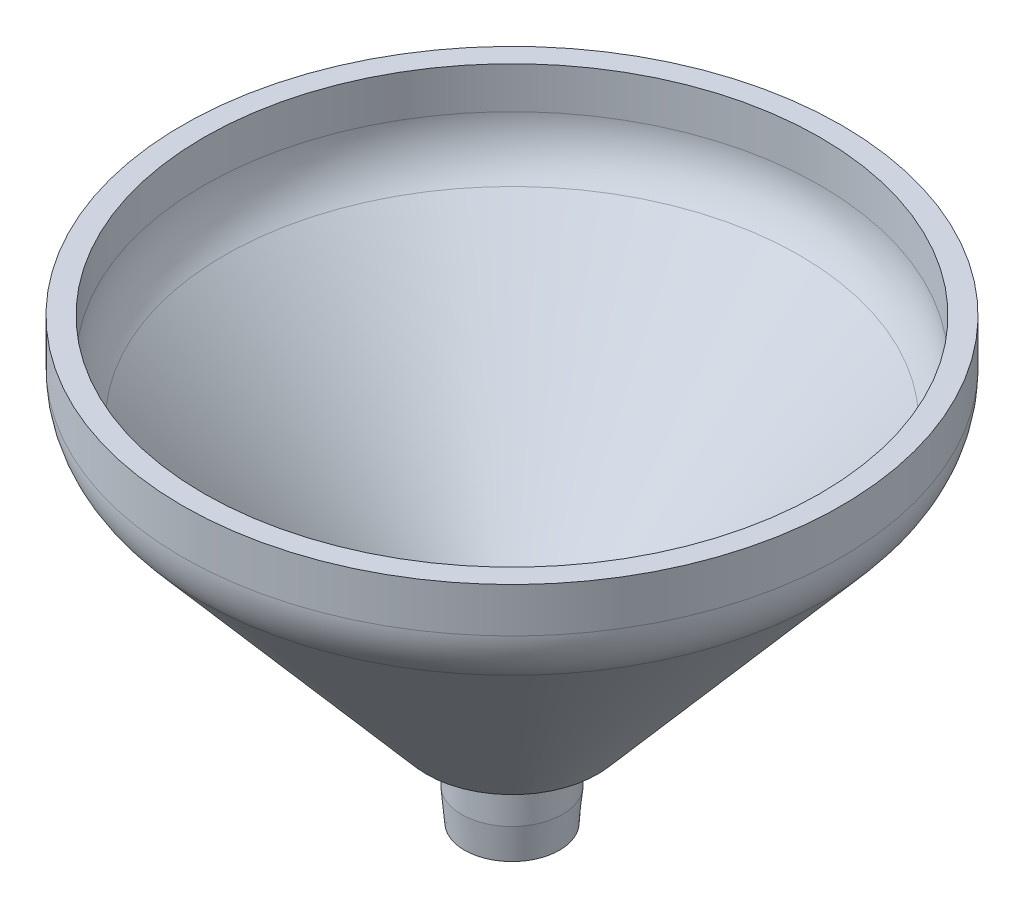
ISO-10303-21;
HEADER;
FILE_DESCRIPTION(('STEP AP214'),'2;1');
FILE_NAME('part.step','',(''),(''),'','','');
FILE_SCHEMA(('AUTOMOTIVE_DESIGN { 1 0 10303 214 1 1 1 1 }'));
ENDSEC;
DATA;
#1=APPLICATION_CONTEXT('core data for automotive mechanical design processes');
#2=APPLICATION_PROTOCOL_DEFINITION('international standard','automotive_design',2000,#1);
#3=PRODUCT_CONTEXT('',#1,'mechanical');
#4=PRODUCT('Part','Part','',(#3));
#5=PRODUCT_RELATED_PRODUCT_CATEGORY('part','',(#4));
#6=PRODUCT_DEFINITION_FORMATION('','',#4);
#7=PRODUCT_DEFINITION_CONTEXT('part definition',#1,'design');
#8=PRODUCT_DEFINITION('design','',#6,#7);
#9=PRODUCT_DEFINITION_SHAPE('','',#8);
#10=(LENGTH_UNIT() NAMED_UNIT(*) SI_UNIT(.MILLI.,.METRE.));
#11=(NAMED_UNIT(*) PLANE_ANGLE_UNIT() SI_UNIT($,.RADIAN.));
#12=(NAMED_UNIT(*) SI_UNIT($,.STERADIAN.) SOLID_ANGLE_UNIT());
#13=UNCERTAINTY_MEASURE_WITH_UNIT(LENGTH_MEASURE(1.E-05),#10,'distance_accuracy_value','');
#14=(GEOMETRIC_REPRESENTATION_CONTEXT(3) GLOBAL_UNCERTAINTY_ASSIGNED_CONTEXT((#13)) GLOBAL_UNIT_ASSIGNED_CONTEXT((#10,
#11,#12)) REPRESENTATION_CONTEXT('',''));
#15=CARTESIAN_POINT('',(0.,0.,0.));
#16=DIRECTION('',(0.,0.,1.));
#17=DIRECTION('',(1.,0.,0.));
#18=AXIS2_PLACEMENT_3D('',#15,#16,#17);
#19=CARTESIAN_POINT('',(0.,0.,0.));
#20=DIRECTION('',(0.,-1.,0.));
#21=DIRECTION('',(0.,0.,-1.));
#22=AXIS2_PLACEMENT_3D('',#19,#20,#21);
#23=CYLINDRICAL_SURFACE('',#22,5.5);
#24=CARTESIAN_POINT('',(0.,9.85786437626905,0.));
#25=DIRECTION('',(0.,1.,0.));
#26=DIRECTION('',(0.,0.,1.));
#27=AXIS2_PLACEMENT_3D('',#24,#25,#26);
#28=CIRCLE('',#27,5.5);
#29=CARTESIAN_POINT('',(0.,9.85786437626905,5.5));
#30=VERTEX_POINT('',#29);
#31=EDGE_CURVE('E57',#30,#30,#28,.T.);
#32=ORIENTED_EDGE('',*,*,#31,.T.);
#33=EDGE_LOOP('',(#32));
#34=FACE_BOUND('',#33,.T.);
#35=CARTESIAN_POINT('',(0.,0.,0.));
#36=DIRECTION('',(0.,-1.,0.));
#37=DIRECTION('',(0.,0.,-1.));
#38=AXIS2_PLACEMENT_3D('',#35,#36,#37);
#39=CIRCLE('',#38,5.5);
#40=CARTESIAN_POINT('',(0.,0.,-5.5));
#41=VERTEX_POINT('',#40);
#42=EDGE_CURVE('E66',#41,#41,#39,.T.);
#43=ORIENTED_EDGE('',*,*,#42,.T.);
#44=EDGE_LOOP('',(#43));
#45=FACE_BOUND('',#44,.T.);
#46=ADVANCED_FACE('F33',(#34,#45),#23,.F.);
#47=CARTESIAN_POINT('',(5.5,0.,0.));
#48=DIRECTION('',(0.,-1.,0.));
#49=DIRECTION('',(0.,0.,-1.));
#50=AXIS2_PLACEMENT_3D('',#47,#48,#49);
#51=PLANE('',#50);
#52=CARTESIAN_POINT('',(0.,0.,0.));
#53=DIRECTION('',(0.,-1.,0.));
#54=DIRECTION('',(0.,0.,-1.));
#55=AXIS2_PLACEMENT_3D('',#52,#53,#54);
#56=CIRCLE('',#55,6.69999999999997);
#57=CARTESIAN_POINT('',(0.,0.,6.69999999999997));
#58=VERTEX_POINT('',#57);
#59=EDGE_CURVE('E41',#58,#58,#56,.T.);
#60=ORIENTED_EDGE('',*,*,#59,.T.);
#61=EDGE_LOOP('',(#60));
#62=FACE_BOUND('',#61,.T.);
#63=ORIENTED_EDGE('',*,*,#42,.F.);
#64=EDGE_LOOP('',(#63));
#65=FACE_BOUND('',#64,.T.);
#66=ADVANCED_FACE('F100',(#62,#65),#51,.T.);
#67=CARTESIAN_POINT('',(0.,0.,0.));
#68=DIRECTION('',(0.,-1.,0.));
#69=DIRECTION('',(0.,0.,-1.));
#70=AXIS2_PLACEMENT_3D('',#67,#68,#69);
#71=CYLINDRICAL_SURFACE('',#70,7.1);
#72=CARTESIAN_POINT('',(0.,4.57202092110491,0.));
#73=DIRECTION('',(0.,-1.,0.));
#74=DIRECTION('',(0.,0.,-1.));
#75=AXIS2_PLACEMENT_3D('',#72,#73,#74);
#76=CIRCLE('',#75,7.1);
#77=CARTESIAN_POINT('',(0.,4.57202092110491,7.1));
#78=VERTEX_POINT('',#77);
#79=EDGE_CURVE('E10',#78,#78,#76,.F.);
#80=ORIENTED_EDGE('',*,*,#79,.T.);
#81=EDGE_LOOP('',(#80));
#82=FACE_BOUND('',#81,.T.);
#83=CARTESIAN_POINT('',(0.,12.,0.));
#84=DIRECTION('',(0.,-1.,0.));
#85=DIRECTION('',(0.,0.,-1.));
#86=AXIS2_PLACEMENT_3D('',#83,#84,#85);
#87=CIRCLE('',#86,7.1);
#88=CARTESIAN_POINT('',(0.,12.,-7.1));
#89=VERTEX_POINT('',#88);
#90=EDGE_CURVE('E69',#89,#89,#87,.T.);
#91=ORIENTED_EDGE('',*,*,#90,.T.);
#92=EDGE_LOOP('',(#91));
#93=FACE_BOUND('',#92,.T.);
#94=ADVANCED_FACE('F106',(#82,#93),#71,.T.);
#95=CARTESIAN_POINT('',(7.1,12.,0.));
#96=DIRECTION('',(0.,-1.,0.));
#97=DIRECTION('',(0.,0.,-1.));
#98=AXIS2_PLACEMENT_3D('',#95,#96,#97);
#99=PLANE('',#98);
#100=CARTESIAN_POINT('',(0.,12.,0.));
#101=DIRECTION('',(0.,-1.,0.));
#102=DIRECTION('',(0.,0.,-1.));
#103=AXIS2_PLACEMENT_3D('',#100,#101,#102);
#104=CIRCLE('',#103,12.1);
#105=CARTESIAN_POINT('',(0.,12.,12.1));
#106=VERTEX_POINT('',#105);
#107=EDGE_CURVE('E72',#106,#106,#104,.T.);
#108=ORIENTED_EDGE('',*,*,#107,.T.);
#109=EDGE_LOOP('',(#108));
#110=FACE_BOUND('',#109,.T.);
#111=ORIENTED_EDGE('',*,*,#90,.F.);
#112=EDGE_LOOP('',(#111));
#113=FACE_BOUND('',#112,.T.);
#114=ADVANCED_FACE('F141',(#110,#113),#99,.T.);
#115=CARTESIAN_POINT('',(0.,12.,0.));
#116=DIRECTION('',(0.,1.,0.));
#117=DIRECTION('',(0.,0.,1.));
#118=AXIS2_PLACEMENT_3D('',#115,#116,#117);
#119=CONICAL_SURFACE('',#118,12.1,0.710271007486688);
#120=CARTESIAN_POINT('',(0.,49.1881999571126,0.));
#121=DIRECTION('',(0.,-1.,0.));
#122=DIRECTION('',(0.,0.,-1.));
#123=AXIS2_PLACEMENT_3D('',#120,#121,#122);
#124=CIRCLE('',#123,44.081851963117);
#125=CARTESIAN_POINT('',(0.,49.1881999571126,44.081851963117));
#126=VERTEX_POINT('',#125);
#127=EDGE_CURVE('E54',#126,#126,#124,.T.);
#128=CARTESIAN_POINT('',(0.,49.1881999571126,44.081851963117));
#129=CARTESIAN_POINT('',(0.,48.800822874226,43.7487076718345));
#130=CARTESIAN_POINT('',(0.,48.4134457913394,43.415563380552));
#131=CARTESIAN_POINT('',(0.,47.6386916255662,42.7492747979871));
#132=CARTESIAN_POINT('',(0.,47.2513145426796,42.4161305067046));
#133=CARTESIAN_POINT('',(0.,46.4765603769065,41.7498419241397));
#134=CARTESIAN_POINT('',(0.,46.0891832940199,41.4166976328572));
#135=CARTESIAN_POINT('',(0.,45.3144291282467,40.7504090502923));
#136=CARTESIAN_POINT('',(0.,44.9270520453601,40.4172647590098));
#137=CARTESIAN_POINT('',(0.,44.1522978795869,39.7509761764449));
#138=CARTESIAN_POINT('',(0.,43.7649207967004,39.4178318851624));
#139=CARTESIAN_POINT('',(0.,42.9901666309272,38.7515433025975));
#140=CARTESIAN_POINT('',(0.,42.6027895480406,38.418399011315));
#141=CARTESIAN_POINT('',(0.,41.8280353822674,37.7521104287501));
#142=CARTESIAN_POINT('',(0.,41.4406582993808,37.4189661374676));
#143=CARTESIAN_POINT('',(0.,40.6659041336076,36.7526775549027));
#144=CARTESIAN_POINT('',(0.,40.278527050721,36.4195332636202));
#145=CARTESIAN_POINT('',(0.,39.5037728849479,35.7532446810552));
#146=CARTESIAN_POINT('',(0.,39.1163958020613,35.4201003897728));
#147=CARTESIAN_POINT('',(0.,38.3416416362881,34.7538118072078));
#148=CARTESIAN_POINT('',(0.,37.9542645534015,34.4206675159254));
#149=CARTESIAN_POINT('',(0.,37.1795103876283,33.7543789333604));
#150=CARTESIAN_POINT('',(0.,36.7921333047417,33.421234642078));
#151=CARTESIAN_POINT('',(0.,36.0173791389686,32.754946059513));
#152=CARTESIAN_POINT('',(0.,35.630002056082,32.4218017682306));
#153=CARTESIAN_POINT('',(0.,34.8552478903088,31.7555131856656));
#154=CARTESIAN_POINT('',(0.,34.4678708074222,31.4223688943832));
#155=CARTESIAN_POINT('',(0.,33.693116641649,30.7560803118182));
#156=CARTESIAN_POINT('',(0.,33.3057395587624,30.4229360205358));
#157=CARTESIAN_POINT('',(0.,32.5309853929893,29.7566474379708));
#158=CARTESIAN_POINT('',(0.,32.1436083101027,29.4235031466884));
#159=CARTESIAN_POINT('',(0.,31.3688541443295,28.7572145641234));
#160=CARTESIAN_POINT('',(0.,30.9814770614429,28.4240702728409));
#161=CARTESIAN_POINT('',(0.,30.2067228956697,27.757781690276));
#162=CARTESIAN_POINT('',(0.,29.8193458127831,27.4246373989935));
#163=CARTESIAN_POINT('',(0.,29.0445916470099,26.7583488164286));
#164=CARTESIAN_POINT('',(0.,28.6572145641234,26.4252045251461));
#165=CARTESIAN_POINT('',(0.,27.8824603983502,25.7589159425812));
#166=CARTESIAN_POINT('',(0.,27.4950833154636,25.4257716512987));
#167=CARTESIAN_POINT('',(0.,26.7203291496904,24.7594830687338));
#168=CARTESIAN_POINT('',(0.,26.3329520668038,24.4263387774513));
#169=CARTESIAN_POINT('',(0.,25.5581979010306,23.7600501948864));
#170=CARTESIAN_POINT('',(0.,25.170820818144,23.4269059036039));
#171=CARTESIAN_POINT('',(0.,24.3960666523709,22.760617321039));
#172=CARTESIAN_POINT('',(0.,24.0086895694843,22.4274730297565));
#173=CARTESIAN_POINT('',(0.,23.2339354037111,21.7611844471916));
#174=CARTESIAN_POINT('',(0.,22.8465583208245,21.4280401559091));
#175=CARTESIAN_POINT('',(0.,22.0718041550513,20.7617515733442));
#176=CARTESIAN_POINT('',(0.,21.6844270721647,20.4286072820617));
#177=CARTESIAN_POINT('',(0.,20.9096729063916,19.7623186994968));
#178=CARTESIAN_POINT('',(0.,20.522295823505,19.4291744082143));
#179=CARTESIAN_POINT('',(0.,19.7475416577318,18.7628858256494));
#180=CARTESIAN_POINT('',(0.,19.3601645748452,18.4297415343669));
#181=CARTESIAN_POINT('',(0.,18.585410409072,17.763452951802));
#182=CARTESIAN_POINT('',(0.,18.1980333261854,17.4303086605195));
#183=CARTESIAN_POINT('',(0.,17.4232791604123,16.7640200779546));
#184=CARTESIAN_POINT('',(0.,17.0359020775257,16.4308757866721));
#185=CARTESIAN_POINT('',(0.,16.2611479117525,15.7645872041072));
#186=CARTESIAN_POINT('',(0.,15.8737708288659,15.4314429128247));
#187=CARTESIAN_POINT('',(0.,15.0990166630927,14.7651543302597));
#188=CARTESIAN_POINT('',(0.,14.7116395802061,14.4320100389773));
#189=CARTESIAN_POINT('',(0.,13.936885414433,13.7657214564123));
#190=CARTESIAN_POINT('',(0.,13.5495083315464,13.4325771651299));
#191=CARTESIAN_POINT('',(0.,12.7747541657732,12.7662885825649));
#192=CARTESIAN_POINT('',(0.,12.3873770828866,12.4331442912825));
#193=CARTESIAN_POINT('',(0.,12.,12.1));
#194=B_SPLINE_CURVE_WITH_KNOTS('',3,(#128,#129,#130,#131,#132,#133,#134,#135,#136,#137,#138,
#139,#140,#141,#142,#143,#144,#145,#146,#147,#148,#149,#150,#151,#152,#153,#154,#155,#156,#157,
#158,#159,#160,#161,#162,#163,#164,#165,#166,#167,#168,#169,#170,#171,#172,#173,#174,#175,#176,
#177,#178,#179,#180,#181,#182,#183,#184,#185,#186,#187,#188,#189,#190,#191,#192,#193),
.UNSPECIFIED.,.F.,.F.,(4,2,2,2,2,2,2,2,2,2,2,2,2,2,2,2,2,2,2,2,2,2,2,2,2,2,2,2,2,2,2,2,4),(0.,
1.53278018921123,3.06556037842245,4.59834056763366,6.13112075684489,7.66390094605611,
9.19668113526734,10.7294613244786,12.2622415136898,13.795021702901,15.3278018921122,
16.8605820813235,18.3933622705347,19.9261424597459,21.4589226489571,22.9917028381684,
24.5244830273796,26.0572632165908,27.590043405802,29.1228235950132,30.6556037842245,
32.1883839734357,33.7211641626469,35.2539443518582,36.7867245410694,38.3195047302806,
39.8522849194918,41.3850651087031,42.9178452979143,44.4506254871255,45.9834056763367,
47.516185865548,49.0489660547592),.UNSPECIFIED.);
#195=EDGE_CURVE('BSEAM184',#126,#106,#194,.T.);
#196=ORIENTED_EDGE('',*,*,#127,.T.);
#197=ORIENTED_EDGE('',*,*,#107,.F.);
#198=ORIENTED_EDGE('',*,*,#195,.T.);
#199=ORIENTED_EDGE('',*,*,#195,.F.);
#200=EDGE_LOOP('',(#196,#198,#197,#199));
#201=FACE_BOUND('',#200,.T.);
#202=ADVANCED_FACE('F184',(#201),#119,.T.);
#203=CARTESIAN_POINT('',(0.,0.,0.));
#204=DIRECTION('',(0.,-1.,0.));
#205=DIRECTION('',(0.,0.,-1.));
#206=AXIS2_PLACEMENT_3D('',#203,#204,#205);
#207=CYLINDRICAL_SURFACE('',#206,46.5000000000001);
#208=CARTESIAN_POINT('',(0.,55.7085926453931,0.));
#209=DIRECTION('',(0.,1.,0.));
#210=DIRECTION('',(0.,0.,1.));
#211=AXIS2_PLACEMENT_3D('',#208,#209,#210);
#212=CIRCLE('',#211,46.5000000000001);
#213=CARTESIAN_POINT('',(0.,55.7085926453931,46.5000000000001));
#214=VERTEX_POINT('',#213);
#215=EDGE_CURVE('E49',#214,#214,#212,.T.);
#216=ORIENTED_EDGE('',*,*,#215,.T.);
#217=EDGE_LOOP('',(#216));
#218=FACE_BOUND('',#217,.T.);
#219=CARTESIAN_POINT('',(0.,62.,0.));
#220=DIRECTION('',(0.,-1.,0.));
#221=DIRECTION('',(0.,0.,-1.));
#222=AXIS2_PLACEMENT_3D('',#219,#220,#221);
#223=CIRCLE('',#222,46.5000000000001);
#224=CARTESIAN_POINT('',(0.,62.,-46.5000000000001));
#225=VERTEX_POINT('',#224);
#226=EDGE_CURVE('E75',#225,#225,#223,.T.);
#227=ORIENTED_EDGE('',*,*,#226,.T.);
#228=EDGE_LOOP('',(#227));
#229=FACE_BOUND('',#228,.T.);
#230=ADVANCED_FACE('F97',(#218,#229),#207,.T.);
#231=CARTESIAN_POINT('',(43.5000000000001,62.,0.));
#232=DIRECTION('',(0.,1.,0.));
#233=DIRECTION('',(0.,0.,1.));
#234=AXIS2_PLACEMENT_3D('',#231,#232,#233);
#235=PLANE('',#234);
#236=CARTESIAN_POINT('',(0.,62.,0.));
#237=DIRECTION('',(0.,-1.,0.));
#238=DIRECTION('',(0.,0.,-1.));
#239=AXIS2_PLACEMENT_3D('',#236,#237,#238);
#240=CIRCLE('',#239,43.5000000000001);
#241=CARTESIAN_POINT('',(0.,62.,-43.5000000000001));
#242=VERTEX_POINT('',#241);
#243=EDGE_CURVE('E78',#242,#242,#240,.T.);
#244=ORIENTED_EDGE('',*,*,#243,.T.);
#245=EDGE_LOOP('',(#244));
#246=FACE_BOUND('',#245,.T.);
#247=ORIENTED_EDGE('',*,*,#226,.F.);
#248=EDGE_LOOP('',(#247));
#249=FACE_BOUND('',#248,.T.);
#250=ADVANCED_FACE('F82',(#246,#249),#235,.T.);
#251=CARTESIAN_POINT('',(0.,0.,0.));
#252=DIRECTION('',(0.,-1.,0.));
#253=DIRECTION('',(0.,0.,-1.));
#254=AXIS2_PLACEMENT_3D('',#251,#252,#253);
#255=CYLINDRICAL_SURFACE('',#254,43.5000000000001);
#256=CARTESIAN_POINT('',(0.,56.142135623731,0.));
#257=DIRECTION('',(0.,-1.,0.));
#258=DIRECTION('',(0.,0.,-1.));
#259=AXIS2_PLACEMENT_3D('',#256,#257,#258);
#260=CIRCLE('',#259,43.5000000000001);
#261=CARTESIAN_POINT('',(0.,56.142135623731,-43.5000000000001));
#262=VERTEX_POINT('',#261);
#263=EDGE_CURVE('E45',#262,#262,#260,.T.);
#264=ORIENTED_EDGE('',*,*,#263,.T.);
#265=EDGE_LOOP('',(#264));
#266=FACE_BOUND('',#265,.T.);
#267=ORIENTED_EDGE('',*,*,#243,.F.);
#268=EDGE_LOOP('',(#267));
#269=FACE_BOUND('',#268,.T.);
#270=ADVANCED_FACE('F85',(#266,#269),#255,.F.);
#271=CARTESIAN_POINT('',(0.,52.,0.));
#272=DIRECTION('',(0.,1.,0.));
#273=DIRECTION('',(0.,0.,1.));
#274=AXIS2_PLACEMENT_3D('',#271,#272,#273);
#275=CONICAL_SURFACE('',#274,43.5000000000001,0.78539816339745);
#276=CARTESIAN_POINT('',(0.,16.9289321881345,0.));
#277=DIRECTION('',(0.,-1.,0.));
#278=DIRECTION('',(0.,0.,-1.));
#279=AXIS2_PLACEMENT_3D('',#276,#277,#278);
#280=CIRCLE('',#279,8.42893218813454);
#281=CARTESIAN_POINT('',(0.,16.9289321881345,8.42893218813454));
#282=VERTEX_POINT('',#281);
#283=EDGE_CURVE('E60',#282,#282,#280,.T.);
#284=CARTESIAN_POINT('',(0.,49.0710678118655,0.));
#285=DIRECTION('',(0.,1.,0.));
#286=DIRECTION('',(0.,0.,1.));
#287=AXIS2_PLACEMENT_3D('',#284,#285,#286);
#288=CIRCLE('',#287,40.5710678118656);
#289=CARTESIAN_POINT('',(0.,49.0710678118655,40.5710678118656));
#290=VERTEX_POINT('',#289);
#291=EDGE_CURVE('E63',#290,#290,#288,.T.);
#292=CARTESIAN_POINT('',(0.,16.9289321881345,8.42893218813454));
#293=CARTESIAN_POINT('',(0.,17.2637461008817,8.76374610088174));
#294=CARTESIAN_POINT('',(0.,17.5985600136289,9.09856001362894));
#295=CARTESIAN_POINT('',(0.,18.2681878391233,9.76818783912333));
#296=CARTESIAN_POINT('',(0.,18.6030017518705,10.1030017518705));
#297=CARTESIAN_POINT('',(0.,19.2726295773649,10.7726295773649));
#298=CARTESIAN_POINT('',(0.,19.6074434901121,11.1074434901121));
#299=CARTESIAN_POINT('',(0.,20.2770713156065,11.7770713156065));
#300=CARTESIAN_POINT('',(0.,20.6118852283537,12.1118852283537));
#301=CARTESIAN_POINT('',(0.,21.2815130538481,12.7815130538481));
#302=CARTESIAN_POINT('',(0.,21.6163269665953,13.1163269665953));
#303=CARTESIAN_POINT('',(0.,22.2859547920897,13.7859547920897));
#304=CARTESIAN_POINT('',(0.,22.6207687048369,14.1207687048369));
#305=CARTESIAN_POINT('',(0.,23.2903965303313,14.7903965303313));
#306=CARTESIAN_POINT('',(0.,23.6252104430785,15.1252104430785));
#307=CARTESIAN_POINT('',(0.,24.2948382685729,15.7948382685729));
#308=CARTESIAN_POINT('',(0.,24.6296521813201,16.1296521813201));
#309=CARTESIAN_POINT('',(0.,25.2992800068145,16.7992800068145));
#310=CARTESIAN_POINT('',(0.,25.6340939195617,17.1340939195617));
#311=CARTESIAN_POINT('',(0.,26.3037217450561,17.8037217450561));
#312=CARTESIAN_POINT('',(0.,26.6385356578032,18.1385356578033));
#313=CARTESIAN_POINT('',(0.,27.3081634832976,18.8081634832977));
#314=CARTESIAN_POINT('',(0.,27.6429773960448,19.1429773960449));
#315=CARTESIAN_POINT('',(0.,28.3126052215392,19.8126052215393));
#316=CARTESIAN_POINT('',(0.,28.6474191342864,20.1474191342865));
#317=CARTESIAN_POINT('',(0.,29.3170469597808,20.8170469597809));
#318=CARTESIAN_POINT('',(0.,29.651860872528,21.1518608725281));
#319=CARTESIAN_POINT('',(0.,30.3214886980224,21.8214886980225));
#320=CARTESIAN_POINT('',(0.,30.6563026107696,22.1563026107697));
#321=CARTESIAN_POINT('',(0.,31.325930436264,22.8259304362641));
#322=CARTESIAN_POINT('',(0.,31.6607443490112,23.1607443490113));
#323=CARTESIAN_POINT('',(0.,32.3303721745056,23.8303721745057));
#324=CARTESIAN_POINT('',(0.,32.6651860872528,24.1651860872529));
#325=CARTESIAN_POINT('',(0.,33.3348139127472,24.8348139127473));
#326=CARTESIAN_POINT('',(0.,33.6696278254944,25.1696278254945));
#327=CARTESIAN_POINT('',(0.,34.3392556509888,25.8392556509889));
#328=CARTESIAN_POINT('',(0.,34.674069563736,26.1740695637361));
#329=CARTESIAN_POINT('',(0.,35.3436973892304,26.8436973892305));
#330=CARTESIAN_POINT('',(0.,35.6785113019776,27.1785113019777));
#331=CARTESIAN_POINT('',(0.,36.348139127472,27.8481391274721));
#332=CARTESIAN_POINT('',(0.,36.6829530402192,28.1829530402193));
#333=CARTESIAN_POINT('',(0.,37.3525808657136,28.8525808657136));
#334=CARTESIAN_POINT('',(0.,37.6873947784608,29.1873947784608));
#335=CARTESIAN_POINT('',(0.,38.3570226039552,29.8570226039552));
#336=CARTESIAN_POINT('',(0.,38.6918365167024,30.1918365167024));
#337=CARTESIAN_POINT('',(0.,39.3614643421967,30.8614643421968));
#338=CARTESIAN_POINT('',(0.,39.6962782549439,31.196278254944));
#339=CARTESIAN_POINT('',(0.,40.3659060804383,31.8659060804384));
#340=CARTESIAN_POINT('',(0.,40.7007199931855,32.2007199931856));
#341=CARTESIAN_POINT('',(0.,41.3703478186799,32.87034781868));
#342=CARTESIAN_POINT('',(0.,41.7051617314271,33.2051617314272));
#343=CARTESIAN_POINT('',(0.,42.3747895569215,33.8747895569216));
#344=CARTESIAN_POINT('',(0.,42.7096034696687,34.2096034696688));
#345=CARTESIAN_POINT('',(0.,43.3792312951631,34.8792312951632));
#346=CARTESIAN_POINT('',(0.,43.7140452079103,35.2140452079104));
#347=CARTESIAN_POINT('',(0.,44.3836730334047,35.8836730334048));
#348=CARTESIAN_POINT('',(0.,44.7184869461519,36.218486946152));
#349=CARTESIAN_POINT('',(0.,45.3881147716463,36.8881147716464));
#350=CARTESIAN_POINT('',(0.,45.7229286843935,37.2229286843936));
#351=CARTESIAN_POINT('',(0.,46.3925565098879,37.892556509888));
#352=CARTESIAN_POINT('',(0.,46.7273704226351,38.2273704226352));
#353=CARTESIAN_POINT('',(0.,47.3969982481295,38.8969982481296));
#354=CARTESIAN_POINT('',(0.,47.7318121608767,39.2318121608768));
#355=CARTESIAN_POINT('',(0.,48.4014399863711,39.9014399863712));
#356=CARTESIAN_POINT('',(0.,48.7362538991183,40.2362538991184));
#357=CARTESIAN_POINT('',(0.,49.0710678118655,40.5710678118656));
#358=B_SPLINE_CURVE_WITH_KNOTS('',3,(#292,#293,#294,#295,#296,#297,#298,#299,#300,#301,#302,
#303,#304,#305,#306,#307,#308,#309,#310,#311,#312,#313,#314,#315,#316,#317,#318,#319,#320,#321,
#322,#323,#324,#325,#326,#327,#328,#329,#330,#331,#332,#333,#334,#335,#336,#337,#338,#339,#340,
#341,#342,#343,#344,#345,#346,#347,#348,#349,#350,#351,#352,#353,#354,#355,#356,#357),
.UNSPECIFIED.,.F.,.F.,(4,2,2,2,2,2,2,2,2,2,2,2,2,2,2,2,2,2,2,2,2,2,2,2,2,2,2,2,2,2,2,2,4),(0.,
1.42049512883487,2.84099025766973,4.26148538650461,5.68198051533947,7.10247564417434,
8.52297077300921,9.94346590184408,11.3639610306789,12.7844561595138,14.2049512883487,
15.6254464171836,17.0459415460184,18.4664366748533,19.8869318036882,21.307426932523,
22.7279220613579,24.1484171901928,25.5689123190276,26.9894074478625,28.4099025766974,
29.8303977055322,31.2508928343671,32.671387963202,34.0918830920368,35.5123782208717,
36.9328733497066,38.3533684785414,39.7738636073763,41.1943587362112,42.614853865046,
44.0353489938809,45.4558441227158),.UNSPECIFIED.);
#359=EDGE_CURVE('BSEAM87',#282,#290,#358,.T.);
#360=ORIENTED_EDGE('',*,*,#283,.T.);
#361=ORIENTED_EDGE('',*,*,#291,.T.);
#362=ORIENTED_EDGE('',*,*,#359,.T.);
#363=ORIENTED_EDGE('',*,*,#359,.F.);
#364=EDGE_LOOP('',(#360,#362,#361,#363));
#365=FACE_BOUND('',#364,.T.);
#366=ADVANCED_FACE('F87',(#365),#275,.F.);
#367=CARTESIAN_POINT('',(0.,9.85786437626905,0.));
#368=DIRECTION('',(0.,1.,0.));
#369=DIRECTION('',(0.,0.,1.));
#370=AXIS2_PLACEMENT_3D('',#367,#368,#369);
#371=TOROIDAL_SURFACE('',#370,15.5,10.);
#372=ORIENTED_EDGE('',*,*,#31,.F.);
#373=EDGE_LOOP('',(#372));
#374=FACE_BOUND('',#373,.T.);
#375=ORIENTED_EDGE('',*,*,#283,.F.);
#376=EDGE_LOOP('',(#375));
#377=FACE_BOUND('',#376,.T.);
#378=ADVANCED_FACE('F94',(#374,#377),#371,.T.);
#379=CARTESIAN_POINT('',(0.,55.7085926453931,0.));
#380=DIRECTION('',(0.,1.,0.));
#381=DIRECTION('',(0.,0.,1.));
#382=AXIS2_PLACEMENT_3D('',#379,#380,#381);
#383=TOROIDAL_SURFACE('',#382,36.5000000000001,10.);
#384=ORIENTED_EDGE('',*,*,#215,.F.);
#385=EDGE_LOOP('',(#384));
#386=FACE_BOUND('',#385,.T.);
#387=ORIENTED_EDGE('',*,*,#127,.F.);
#388=EDGE_LOOP('',(#387));
#389=FACE_BOUND('',#388,.T.);
#390=ADVANCED_FACE('F113',(#386,#389),#383,.T.);
#391=CARTESIAN_POINT('',(0.,56.142135623731,0.));
#392=DIRECTION('',(0.,-1.,0.));
#393=DIRECTION('',(0.,0.,-1.));
#394=AXIS2_PLACEMENT_3D('',#391,#392,#393);
#395=TOROIDAL_SURFACE('',#394,33.5000000000001,10.);
#396=ORIENTED_EDGE('',*,*,#291,.F.);
#397=EDGE_LOOP('',(#396));
#398=FACE_BOUND('',#397,.T.);
#399=ORIENTED_EDGE('',*,*,#263,.F.);
#400=EDGE_LOOP('',(#399));
#401=FACE_BOUND('',#400,.T.);
#402=ADVANCED_FACE('F116',(#398,#401),#395,.F.);
#403=CARTESIAN_POINT('',(0.,0.,0.));
#404=DIRECTION('',(0.,1.,0.));
#405=DIRECTION('',(0.,0.,1.));
#406=AXIS2_PLACEMENT_3D('',#403,#404,#405);
#407=CONICAL_SURFACE('',#406,6.69999999999997,0.0872664625997166);
#408=CARTESIAN_POINT('',(0.,4.57202092110491,7.1));
#409=CARTESIAN_POINT('',(0.,4.52439570317673,7.09583333333333));
#410=CARTESIAN_POINT('',(0.,4.47677048524856,7.09166666666667));
#411=CARTESIAN_POINT('',(0.,4.38152004939221,7.08333333333333));
#412=CARTESIAN_POINT('',(0.,4.33389483146403,7.07916666666666));
#413=CARTESIAN_POINT('',(0.,4.23864439560768,7.07083333333333));
#414=CARTESIAN_POINT('',(0.,4.1910191776795,7.06666666666666));
#415=CARTESIAN_POINT('',(0.,4.09576874182315,7.05833333333333));
#416=CARTESIAN_POINT('',(0.,4.04814352389497,7.05416666666666));
#417=CARTESIAN_POINT('',(0.,3.95289308803862,7.04583333333333));
#418=CARTESIAN_POINT('',(0.,3.90526787011045,7.04166666666666));
#419=CARTESIAN_POINT('',(0.,3.81001743425409,7.03333333333333));
#420=CARTESIAN_POINT('',(0.,3.76239221632592,7.02916666666666));
#421=CARTESIAN_POINT('',(0.,3.66714178046956,7.02083333333333));
#422=CARTESIAN_POINT('',(0.,3.61951656254139,7.01666666666666));
#423=CARTESIAN_POINT('',(0.,3.52426612668504,7.00833333333333));
#424=CARTESIAN_POINT('',(0.,3.47664090875686,7.00416666666666));
#425=CARTESIAN_POINT('',(0.,3.38139047290051,6.99583333333332));
#426=CARTESIAN_POINT('',(0.,3.33376525497233,6.99166666666666));
#427=CARTESIAN_POINT('',(0.,3.23851481911598,6.98333333333332));
#428=CARTESIAN_POINT('',(0.,3.1908896011878,6.97916666666666));
#429=CARTESIAN_POINT('',(0.,3.09563916533145,6.97083333333332));
#430=CARTESIAN_POINT('',(0.,3.04801394740327,6.96666666666666));
#431=CARTESIAN_POINT('',(0.,2.95276351154692,6.95833333333332));
#432=CARTESIAN_POINT('',(0.,2.90513829361875,6.95416666666665));
#433=CARTESIAN_POINT('',(0.,2.80988785776239,6.94583333333332));
#434=CARTESIAN_POINT('',(0.,2.76226263983422,6.94166666666665));
#435=CARTESIAN_POINT('',(0.,2.66701220397787,6.93333333333332));
#436=CARTESIAN_POINT('',(0.,2.61938698604969,6.92916666666665));
#437=CARTESIAN_POINT('',(0.,2.52413655019334,6.92083333333332));
#438=CARTESIAN_POINT('',(0.,2.47651133226516,6.91666666666665));
#439=CARTESIAN_POINT('',(0.,2.38126089640881,6.90833333333332));
#440=CARTESIAN_POINT('',(0.,2.33363567848063,6.90416666666665));
#441=CARTESIAN_POINT('',(0.,2.23838524262428,6.89583333333332));
#442=CARTESIAN_POINT('',(0.,2.1907600246961,6.89166666666665));
#443=CARTESIAN_POINT('',(0.,2.09550958883975,6.88333333333332));
#444=CARTESIAN_POINT('',(0.,2.04788437091158,6.87916666666665));
#445=CARTESIAN_POINT('',(0.,1.95263393505522,6.87083333333331));
#446=CARTESIAN_POINT('',(0.,1.90500871712705,6.86666666666665));
#447=CARTESIAN_POINT('',(0.,1.80975828127069,6.85833333333331));
#448=CARTESIAN_POINT('',(0.,1.76213306334252,6.85416666666665));
#449=CARTESIAN_POINT('',(0.,1.66688262748617,6.84583333333331));
#450=CARTESIAN_POINT('',(0.,1.61925740955799,6.84166666666665));
#451=CARTESIAN_POINT('',(0.,1.52400697370164,6.83333333333331));
#452=CARTESIAN_POINT('',(0.,1.47638175577346,6.82916666666664));
#453=CARTESIAN_POINT('',(0.,1.38113131991711,6.82083333333331));
#454=CARTESIAN_POINT('',(0.,1.33350610198893,6.81666666666664));
#455=CARTESIAN_POINT('',(0.,1.23825566613258,6.80833333333331));
#456=CARTESIAN_POINT('',(0.,1.1906304482044,6.80416666666664));
#457=CARTESIAN_POINT('',(0.,1.09538001234805,6.79583333333331));
#458=CARTESIAN_POINT('',(0.,1.04775479441988,6.79166666666664));
#459=CARTESIAN_POINT('',(0.,0.952504358563523,6.78333333333331));
#460=CARTESIAN_POINT('',(0.,0.904879140635347,6.77916666666664));
#461=CARTESIAN_POINT('',(0.,0.809628704778995,6.77083333333331));
#462=CARTESIAN_POINT('',(0.,0.762003486850819,6.76666666666664));
#463=CARTESIAN_POINT('',(0.,0.666753050994466,6.7583333333333));
#464=CARTESIAN_POINT('',(0.,0.61912783306629,6.75416666666664));
#465=CARTESIAN_POINT('',(0.,0.523877397209938,6.7458333333333));
#466=CARTESIAN_POINT('',(0.,0.476252179281762,6.74166666666664));
#467=CARTESIAN_POINT('',(0.,0.381001743425409,6.7333333333333));
#468=CARTESIAN_POINT('',(0.,0.333376525497233,6.72916666666664));
#469=CARTESIAN_POINT('',(0.,0.238126089640881,6.7208333333333));
#470=CARTESIAN_POINT('',(0.,0.190500871712705,6.71666666666663));
#471=CARTESIAN_POINT('',(0.,0.0952504358563526,6.7083333333333));
#472=CARTESIAN_POINT('',(0.,0.0476252179281763,6.70416666666663));
#473=CARTESIAN_POINT('',(0.,0.,6.69999999999997));
#474=B_SPLINE_CURVE_WITH_KNOTS('',3,(#408,#409,#410,#411,#412,#413,#414,#415,#416,#417,#418,
#419,#420,#421,#422,#423,#424,#425,#426,#427,#428,#429,#430,#431,#432,#433,#434,#435,#436,#437,
#438,#439,#440,#441,#442,#443,#444,#445,#446,#447,#448,#449,#450,#451,#452,#453,#454,#455,#456,
#457,#458,#459,#460,#461,#462,#463,#464,#465,#466,#467,#468,#469,#470,#471,#472,#473),
.UNSPECIFIED.,.F.,.F.,(4,2,2,2,2,2,2,2,2,2,2,2,2,2,2,2,2,2,2,2,2,2,2,2,2,2,2,2,2,2,2,2,4),(0.,
0.143421415570885,0.28684283114177,0.430264246712655,0.57368566228354,0.717107077854425,
0.860528493425309,1.00394990899619,1.14737132456708,1.29079274013796,1.43421415570885,
1.57763557127973,1.72105698685062,1.8644784024215,2.00789981799239,2.15132123356327,
2.29474264913416,2.43816406470504,2.58158548027593,2.72500689584681,2.8684283114177,
3.01184972698858,3.15527114255947,3.29869255813035,3.44211397370124,3.58553538927212,
3.72895680484301,3.87237822041389,4.01579963598478,4.15922105155566,4.30264246712655,
4.44606388269743,4.58948529826832),.UNSPECIFIED.);
#475=EDGE_CURVE('BSEAM36',#78,#58,#474,.T.);
#476=ORIENTED_EDGE('',*,*,#79,.F.);
#477=ORIENTED_EDGE('',*,*,#59,.F.);
#478=ORIENTED_EDGE('',*,*,#475,.T.);
#479=ORIENTED_EDGE('',*,*,#475,.F.);
#480=EDGE_LOOP('',(#476,#478,#477,#479));
#481=FACE_BOUND('',#480,.T.);
#482=ADVANCED_FACE('F36',(#481),#407,.T.);
#483=CLOSED_SHELL('',(#46,#66,#94,#114,#202,#230,#250,#270,#366,#378,#390,#402,#482));
#484=MANIFOLD_SOLID_BREP('B2',#483);
#485=ADVANCED_BREP_SHAPE_REPRESENTATION('',(#18,#484),#14);
#486=SHAPE_DEFINITION_REPRESENTATION(#9,#485);
ENDSEC;
END-ISO-10303-21;
